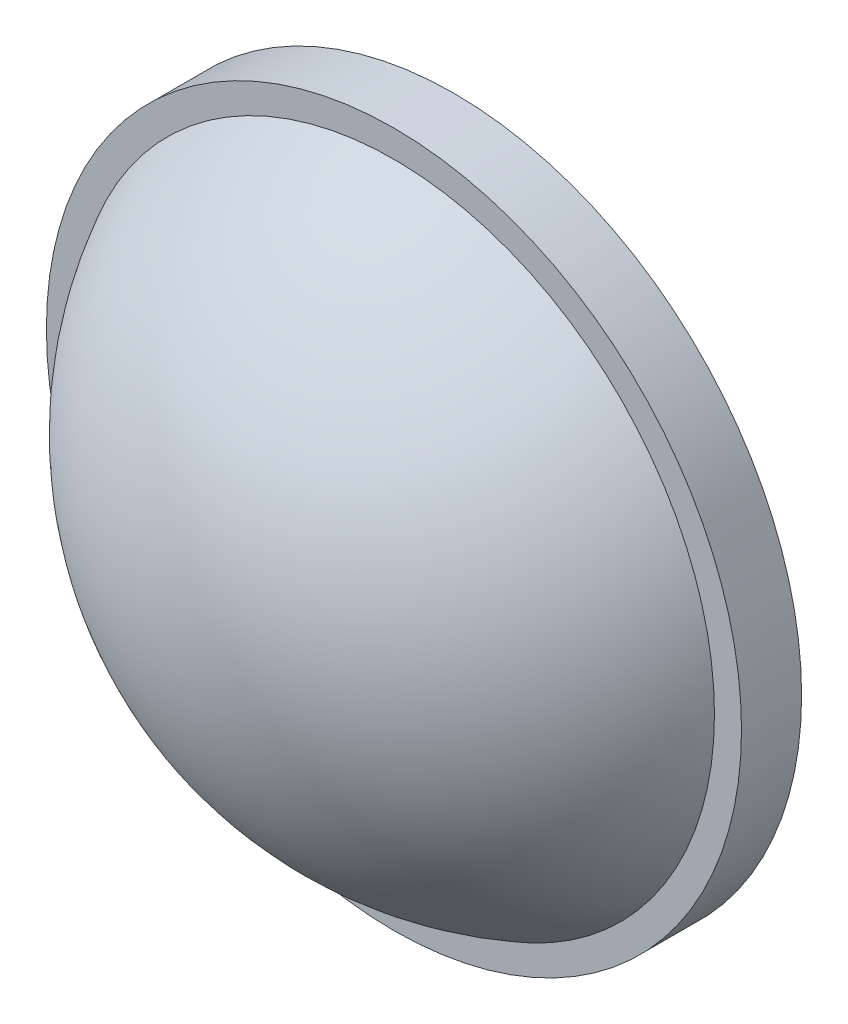
ISO-10303-21;
HEADER;
FILE_DESCRIPTION(('STEP AP214'),'2;1');
FILE_NAME('part.step','',(''),(''),'','','');
FILE_SCHEMA(('AUTOMOTIVE_DESIGN { 1 0 10303 214 1 1 1 1 }'));
ENDSEC;
DATA;
#1=APPLICATION_CONTEXT('core data for automotive mechanical design processes');
#2=APPLICATION_PROTOCOL_DEFINITION('international standard','automotive_design',2000,#1);
#3=PRODUCT_CONTEXT('',#1,'mechanical');
#4=PRODUCT('Part','Part','',(#3));
#5=PRODUCT_RELATED_PRODUCT_CATEGORY('part','',(#4));
#6=PRODUCT_DEFINITION_FORMATION('','',#4);
#7=PRODUCT_DEFINITION_CONTEXT('part definition',#1,'design');
#8=PRODUCT_DEFINITION('design','',#6,#7);
#9=PRODUCT_DEFINITION_SHAPE('','',#8);
#10=(LENGTH_UNIT() NAMED_UNIT(*) SI_UNIT(.MILLI.,.METRE.));
#11=(NAMED_UNIT(*) PLANE_ANGLE_UNIT() SI_UNIT($,.RADIAN.));
#12=(NAMED_UNIT(*) SI_UNIT($,.STERADIAN.) SOLID_ANGLE_UNIT());
#13=UNCERTAINTY_MEASURE_WITH_UNIT(LENGTH_MEASURE(1.E-05),#10,'distance_accuracy_value','');
#14=(GEOMETRIC_REPRESENTATION_CONTEXT(3) GLOBAL_UNCERTAINTY_ASSIGNED_CONTEXT((#13)) GLOBAL_UNIT_ASSIGNED_CONTEXT((#10,
#11,#12)) REPRESENTATION_CONTEXT('',''));
#15=CARTESIAN_POINT('',(0.,0.,0.));
#16=DIRECTION('',(0.,0.,1.));
#17=DIRECTION('',(1.,0.,0.));
#18=AXIS2_PLACEMENT_3D('',#15,#16,#17);
#19=CARTESIAN_POINT('',(0.,0.,3.));
#20=DIRECTION('',(0.,0.,1.));
#21=DIRECTION('',(1.,0.,0.));
#22=AXIS2_PLACEMENT_3D('',#19,#20,#21);
#23=PLANE('',#22);
#24=CARTESIAN_POINT('',(0.,0.,3.));
#25=DIRECTION('',(0.,0.,1.));
#26=DIRECTION('',(1.,0.,0.));
#27=AXIS2_PLACEMENT_3D('',#24,#25,#26);
#28=CIRCLE('',#27,17.35);
#29=CARTESIAN_POINT('',(17.35,0.,3.));
#30=VERTEX_POINT('',#29);
#31=EDGE_CURVE('E43',#30,#30,#28,.T.);
#32=ORIENTED_EDGE('',*,*,#31,.T.);
#33=EDGE_LOOP('',(#32));
#34=FACE_BOUND('',#33,.T.);
#35=CARTESIAN_POINT('',(0.,0.,3.));
#36=DIRECTION('',(0.,0.,1.));
#37=DIRECTION('',(1.,0.,0.));
#38=AXIS2_PLACEMENT_3D('',#35,#36,#37);
#39=CIRCLE('',#38,16.);
#40=CARTESIAN_POINT('',(16.,0.,3.));
#41=VERTEX_POINT('',#40);
#42=EDGE_CURVE('E10',#41,#41,#39,.F.);
#43=ORIENTED_EDGE('',*,*,#42,.T.);
#44=EDGE_LOOP('',(#43));
#45=FACE_BOUND('',#44,.T.);
#46=ADVANCED_FACE('F35',(#34,#45),#23,.T.);
#47=CARTESIAN_POINT('',(0.,0.,3.));
#48=DIRECTION('',(0.,0.,-1.));
#49=DIRECTION('',(-1.,0.,0.));
#50=AXIS2_PLACEMENT_3D('',#47,#48,#49);
#51=CYLINDRICAL_SURFACE('',#50,17.35);
#52=ORIENTED_EDGE('',*,*,#31,.F.);
#53=EDGE_LOOP('',(#52));
#54=FACE_BOUND('',#53,.T.);
#55=CARTESIAN_POINT('',(0.,0.,0.));
#56=DIRECTION('',(0.,0.,1.));
#57=DIRECTION('',(1.,0.,0.));
#58=AXIS2_PLACEMENT_3D('',#55,#56,#57);
#59=CIRCLE('',#58,17.35);
#60=CARTESIAN_POINT('',(17.35,0.,0.));
#61=VERTEX_POINT('',#60);
#62=EDGE_CURVE('E49',#61,#61,#59,.T.);
#63=ORIENTED_EDGE('',*,*,#62,.T.);
#64=EDGE_LOOP('',(#63));
#65=FACE_BOUND('',#64,.T.);
#66=ADVANCED_FACE('F56',(#54,#65),#51,.T.);
#67=CARTESIAN_POINT('',(0.,0.,-5.25320512820512));
#68=DIRECTION('',(0.,0.,1.));
#69=DIRECTION('',(1.,0.,0.));
#70=AXIS2_PLACEMENT_3D('',#67,#68,#69);
#71=SPHERICAL_SURFACE('',#70,18.0032051282051);
#72=ORIENTED_EDGE('',*,*,#42,.F.);
#73=EDGE_LOOP('',(#72));
#74=FACE_BOUND('',#73,.T.);
#75=ADVANCED_FACE('F37',(#74),#71,.T.);
#76=CARTESIAN_POINT('',(0.,0.,0.));
#77=DIRECTION('',(0.,0.,1.));
#78=DIRECTION('',(1.,0.,0.));
#79=AXIS2_PLACEMENT_3D('',#76,#77,#78);
#80=PLANE('',#79);
#81=ORIENTED_EDGE('',*,*,#62,.F.);
#82=EDGE_LOOP('',(#81));
#83=FACE_BOUND('',#82,.T.);
#84=ADVANCED_FACE('F58',(#83),#80,.F.);
#85=CLOSED_SHELL('',(#46,#66,#75,#84));
#86=MANIFOLD_SOLID_BREP('B2',#85);
#87=ADVANCED_BREP_SHAPE_REPRESENTATION('',(#18,#86),#14);
#88=SHAPE_DEFINITION_REPRESENTATION(#9,#87);
ENDSEC;
END-ISO-10303-21;
